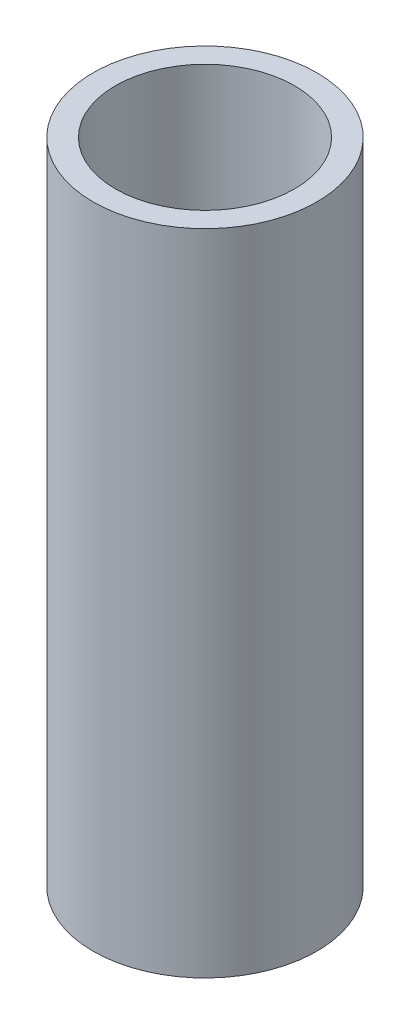
ISO-10303-21;
HEADER;
FILE_DESCRIPTION(('STEP AP214'),'2;1');
FILE_NAME('part.step','',(''),(''),'','','');
FILE_SCHEMA(('AUTOMOTIVE_DESIGN { 1 0 10303 214 1 1 1 1 }'));
ENDSEC;
DATA;
#1=APPLICATION_CONTEXT('core data for automotive mechanical design processes');
#2=APPLICATION_PROTOCOL_DEFINITION('international standard','automotive_design',2000,#1);
#3=PRODUCT_CONTEXT('',#1,'mechanical');
#4=PRODUCT('Part','Part','',(#3));
#5=PRODUCT_RELATED_PRODUCT_CATEGORY('part','',(#4));
#6=PRODUCT_DEFINITION_FORMATION('','',#4);
#7=PRODUCT_DEFINITION_CONTEXT('part definition',#1,'design');
#8=PRODUCT_DEFINITION('design','',#6,#7);
#9=PRODUCT_DEFINITION_SHAPE('','',#8);
#10=(LENGTH_UNIT() NAMED_UNIT(*) SI_UNIT(.MILLI.,.METRE.));
#11=(NAMED_UNIT(*) PLANE_ANGLE_UNIT() SI_UNIT($,.RADIAN.));
#12=(NAMED_UNIT(*) SI_UNIT($,.STERADIAN.) SOLID_ANGLE_UNIT());
#13=UNCERTAINTY_MEASURE_WITH_UNIT(LENGTH_MEASURE(1.E-05),#10,'distance_accuracy_value','');
#14=(GEOMETRIC_REPRESENTATION_CONTEXT(3) GLOBAL_UNCERTAINTY_ASSIGNED_CONTEXT((#13)) GLOBAL_UNIT_ASSIGNED_CONTEXT((#10,
#11,#12)) REPRESENTATION_CONTEXT('',''));
#15=CARTESIAN_POINT('',(0.,0.,0.));
#16=DIRECTION('',(0.,0.,1.));
#17=DIRECTION('',(1.,0.,0.));
#18=AXIS2_PLACEMENT_3D('',#15,#16,#17);
#19=CARTESIAN_POINT('',(0.,29.,0.));
#20=DIRECTION('',(0.,1.,0.));
#21=DIRECTION('',(0.,0.,1.));
#22=AXIS2_PLACEMENT_3D('',#19,#20,#21);
#23=PLANE('',#22);
#24=CARTESIAN_POINT('',(0.,29.,0.));
#25=DIRECTION('',(0.,1.,0.));
#26=DIRECTION('',(0.,0.,1.));
#27=AXIS2_PLACEMENT_3D('',#24,#25,#26);
#28=CIRCLE('',#27,5.);
#29=CARTESIAN_POINT('',(0.,29.,-5.));
#30=VERTEX_POINT('',#29);
#31=EDGE_CURVE('E10',#30,#30,#28,.T.);
#32=ORIENTED_EDGE('',*,*,#31,.T.);
#33=EDGE_LOOP('',(#32));
#34=FACE_BOUND('',#33,.T.);
#35=CARTESIAN_POINT('',(0.,29.,0.));
#36=DIRECTION('',(0.,1.,0.));
#37=DIRECTION('',(0.,0.,1.));
#38=AXIS2_PLACEMENT_3D('',#35,#36,#37);
#39=CIRCLE('',#38,4.);
#40=CARTESIAN_POINT('',(0.,29.,-4.));
#41=VERTEX_POINT('',#40);
#42=EDGE_CURVE('E44',#41,#41,#39,.T.);
#43=ORIENTED_EDGE('',*,*,#42,.F.);
#44=EDGE_LOOP('',(#43));
#45=FACE_BOUND('',#44,.T.);
#46=ADVANCED_FACE('F33',(#34,#45),#23,.T.);
#47=CARTESIAN_POINT('',(0.,0.,0.));
#48=DIRECTION('',(0.,1.,0.));
#49=DIRECTION('',(0.,0.,1.));
#50=AXIS2_PLACEMENT_3D('',#47,#48,#49);
#51=PLANE('',#50);
#52=CARTESIAN_POINT('',(0.,0.,0.));
#53=DIRECTION('',(0.,1.,0.));
#54=DIRECTION('',(0.,0.,1.));
#55=AXIS2_PLACEMENT_3D('',#52,#53,#54);
#56=CIRCLE('',#55,5.);
#57=CARTESIAN_POINT('',(0.,0.,-5.));
#58=VERTEX_POINT('',#57);
#59=EDGE_CURVE('E37',#58,#58,#56,.T.);
#60=ORIENTED_EDGE('',*,*,#59,.F.);
#61=EDGE_LOOP('',(#60));
#62=FACE_BOUND('',#61,.T.);
#63=CARTESIAN_POINT('',(0.,0.,0.));
#64=DIRECTION('',(0.,1.,0.));
#65=DIRECTION('',(0.,0.,1.));
#66=AXIS2_PLACEMENT_3D('',#63,#64,#65);
#67=CIRCLE('',#66,4.);
#68=CARTESIAN_POINT('',(0.,0.,-4.));
#69=VERTEX_POINT('',#68);
#70=EDGE_CURVE('E46',#69,#69,#67,.T.);
#71=ORIENTED_EDGE('',*,*,#70,.T.);
#72=EDGE_LOOP('',(#71));
#73=FACE_BOUND('',#72,.T.);
#74=ADVANCED_FACE('F56',(#62,#73),#51,.F.);
#75=CARTESIAN_POINT('',(0.,29.,0.));
#76=DIRECTION('',(0.,-1.,0.));
#77=DIRECTION('',(0.,0.,-1.));
#78=AXIS2_PLACEMENT_3D('',#75,#76,#77);
#79=CYLINDRICAL_SURFACE('',#78,5.);
#80=CARTESIAN_POINT('',(0.,29.,-5.));
#81=CARTESIAN_POINT('',(0.,28.6979166666667,-5.));
#82=CARTESIAN_POINT('',(0.,28.3958333333333,-5.));
#83=CARTESIAN_POINT('',(0.,27.7916666666667,-5.));
#84=CARTESIAN_POINT('',(0.,27.4895833333333,-5.));
#85=CARTESIAN_POINT('',(0.,26.8854166666667,-5.));
#86=CARTESIAN_POINT('',(0.,26.5833333333333,-5.));
#87=CARTESIAN_POINT('',(0.,25.9791666666667,-5.));
#88=CARTESIAN_POINT('',(0.,25.6770833333333,-5.));
#89=CARTESIAN_POINT('',(0.,25.0729166666667,-5.));
#90=CARTESIAN_POINT('',(0.,24.7708333333333,-5.));
#91=CARTESIAN_POINT('',(0.,24.1666666666667,-5.));
#92=CARTESIAN_POINT('',(0.,23.8645833333333,-5.));
#93=CARTESIAN_POINT('',(0.,23.2604166666667,-5.));
#94=CARTESIAN_POINT('',(0.,22.9583333333333,-5.));
#95=CARTESIAN_POINT('',(0.,22.3541666666667,-5.));
#96=CARTESIAN_POINT('',(0.,22.0520833333333,-5.));
#97=CARTESIAN_POINT('',(0.,21.4479166666667,-5.));
#98=CARTESIAN_POINT('',(0.,21.1458333333333,-5.));
#99=CARTESIAN_POINT('',(0.,20.5416666666667,-5.));
#100=CARTESIAN_POINT('',(0.,20.2395833333333,-5.));
#101=CARTESIAN_POINT('',(0.,19.6354166666667,-5.));
#102=CARTESIAN_POINT('',(0.,19.3333333333333,-5.));
#103=CARTESIAN_POINT('',(0.,18.7291666666667,-5.));
#104=CARTESIAN_POINT('',(0.,18.4270833333333,-5.));
#105=CARTESIAN_POINT('',(0.,17.8229166666667,-5.));
#106=CARTESIAN_POINT('',(0.,17.5208333333333,-5.));
#107=CARTESIAN_POINT('',(0.,16.9166666666667,-5.));
#108=CARTESIAN_POINT('',(0.,16.6145833333333,-5.));
#109=CARTESIAN_POINT('',(0.,16.0104166666667,-5.));
#110=CARTESIAN_POINT('',(0.,15.7083333333333,-5.));
#111=CARTESIAN_POINT('',(0.,15.1041666666667,-5.));
#112=CARTESIAN_POINT('',(0.,14.8020833333333,-5.));
#113=CARTESIAN_POINT('',(0.,14.1979166666667,-5.));
#114=CARTESIAN_POINT('',(0.,13.8958333333333,-5.));
#115=CARTESIAN_POINT('',(0.,13.2916666666667,-5.));
#116=CARTESIAN_POINT('',(0.,12.9895833333333,-5.));
#117=CARTESIAN_POINT('',(0.,12.3854166666667,-5.));
#118=CARTESIAN_POINT('',(0.,12.0833333333333,-5.));
#119=CARTESIAN_POINT('',(0.,11.4791666666667,-5.));
#120=CARTESIAN_POINT('',(0.,11.1770833333333,-5.));
#121=CARTESIAN_POINT('',(0.,10.5729166666667,-5.));
#122=CARTESIAN_POINT('',(0.,10.2708333333333,-5.));
#123=CARTESIAN_POINT('',(0.,9.66666666666667,-5.));
#124=CARTESIAN_POINT('',(0.,9.36458333333333,-5.));
#125=CARTESIAN_POINT('',(0.,8.76041666666667,-5.));
#126=CARTESIAN_POINT('',(0.,8.45833333333333,-5.));
#127=CARTESIAN_POINT('',(0.,7.85416666666667,-5.));
#128=CARTESIAN_POINT('',(0.,7.55208333333333,-5.));
#129=CARTESIAN_POINT('',(0.,6.94791666666667,-5.));
#130=CARTESIAN_POINT('',(0.,6.64583333333333,-5.));
#131=CARTESIAN_POINT('',(0.,6.04166666666667,-5.));
#132=CARTESIAN_POINT('',(0.,5.73958333333333,-5.));
#133=CARTESIAN_POINT('',(0.,5.13541666666667,-5.));
#134=CARTESIAN_POINT('',(0.,4.83333333333333,-5.));
#135=CARTESIAN_POINT('',(0.,4.22916666666667,-5.));
#136=CARTESIAN_POINT('',(0.,3.92708333333333,-5.));
#137=CARTESIAN_POINT('',(0.,3.32291666666667,-5.));
#138=CARTESIAN_POINT('',(0.,3.02083333333333,-5.));
#139=CARTESIAN_POINT('',(0.,2.41666666666667,-5.));
#140=CARTESIAN_POINT('',(0.,2.11458333333333,-5.));
#141=CARTESIAN_POINT('',(0.,1.51041666666667,-5.));
#142=CARTESIAN_POINT('',(0.,1.20833333333333,-5.));
#143=CARTESIAN_POINT('',(0.,0.604166666666667,-5.));
#144=CARTESIAN_POINT('',(0.,0.302083333333333,-5.));
#145=CARTESIAN_POINT('',(0.,0.,-5.));
#146=B_SPLINE_CURVE_WITH_KNOTS('',3,(#80,#81,#82,#83,#84,#85,#86,#87,#88,#89,#90,#91,#92,#93,
#94,#95,#96,#97,#98,#99,#100,#101,#102,#103,#104,#105,#106,#107,#108,#109,#110,#111,#112,#113,
#114,#115,#116,#117,#118,#119,#120,#121,#122,#123,#124,#125,#126,#127,#128,#129,#130,#131,#132,
#133,#134,#135,#136,#137,#138,#139,#140,#141,#142,#143,#144,#145),.UNSPECIFIED.,.F.,.F.,(4,2,2,
2,2,2,2,2,2,2,2,2,2,2,2,2,2,2,2,2,2,2,2,2,2,2,2,2,2,2,2,2,4),(0.,0.906249999999997,1.8125,
2.71875,3.625,4.53125,5.4375,6.34375,7.25,8.15625,9.0625,9.96875,10.875,11.78125,12.6875,
13.59375,14.5,15.40625,16.3125,17.21875,18.125,19.03125,19.9375,20.84375,21.75,22.65625,23.5625,
24.46875,25.375,26.28125,27.1875,28.09375,29.),.UNSPECIFIED.);
#147=EDGE_CURVE('BSEAM35',#30,#58,#146,.T.);
#148=ORIENTED_EDGE('',*,*,#31,.F.);
#149=ORIENTED_EDGE('',*,*,#59,.T.);
#150=ORIENTED_EDGE('',*,*,#147,.T.);
#151=ORIENTED_EDGE('',*,*,#147,.F.);
#152=EDGE_LOOP('',(#148,#150,#149,#151));
#153=FACE_BOUND('',#152,.T.);
#154=ADVANCED_FACE('F35',(#153),#79,.T.);
#155=CARTESIAN_POINT('',(0.,29.,0.));
#156=DIRECTION('',(0.,-1.,0.));
#157=DIRECTION('',(0.,0.,-1.));
#158=AXIS2_PLACEMENT_3D('',#155,#156,#157);
#159=CYLINDRICAL_SURFACE('',#158,4.);
#160=CARTESIAN_POINT('',(0.,29.,-4.));
#161=CARTESIAN_POINT('',(0.,28.6979166666667,-4.));
#162=CARTESIAN_POINT('',(0.,28.3958333333333,-4.));
#163=CARTESIAN_POINT('',(0.,27.7916666666667,-4.));
#164=CARTESIAN_POINT('',(0.,27.4895833333333,-4.));
#165=CARTESIAN_POINT('',(0.,26.8854166666667,-4.));
#166=CARTESIAN_POINT('',(0.,26.5833333333333,-4.));
#167=CARTESIAN_POINT('',(0.,25.9791666666667,-4.));
#168=CARTESIAN_POINT('',(0.,25.6770833333333,-4.));
#169=CARTESIAN_POINT('',(0.,25.0729166666667,-4.));
#170=CARTESIAN_POINT('',(0.,24.7708333333333,-4.));
#171=CARTESIAN_POINT('',(0.,24.1666666666667,-4.));
#172=CARTESIAN_POINT('',(0.,23.8645833333333,-4.));
#173=CARTESIAN_POINT('',(0.,23.2604166666667,-4.));
#174=CARTESIAN_POINT('',(0.,22.9583333333333,-4.));
#175=CARTESIAN_POINT('',(0.,22.3541666666667,-4.));
#176=CARTESIAN_POINT('',(0.,22.0520833333333,-4.));
#177=CARTESIAN_POINT('',(0.,21.4479166666667,-4.));
#178=CARTESIAN_POINT('',(0.,21.1458333333333,-4.));
#179=CARTESIAN_POINT('',(0.,20.5416666666667,-4.));
#180=CARTESIAN_POINT('',(0.,20.2395833333333,-4.));
#181=CARTESIAN_POINT('',(0.,19.6354166666667,-4.));
#182=CARTESIAN_POINT('',(0.,19.3333333333333,-4.));
#183=CARTESIAN_POINT('',(0.,18.7291666666667,-4.));
#184=CARTESIAN_POINT('',(0.,18.4270833333333,-4.));
#185=CARTESIAN_POINT('',(0.,17.8229166666667,-4.));
#186=CARTESIAN_POINT('',(0.,17.5208333333333,-4.));
#187=CARTESIAN_POINT('',(0.,16.9166666666667,-4.));
#188=CARTESIAN_POINT('',(0.,16.6145833333333,-4.));
#189=CARTESIAN_POINT('',(0.,16.0104166666667,-4.));
#190=CARTESIAN_POINT('',(0.,15.7083333333333,-4.));
#191=CARTESIAN_POINT('',(0.,15.1041666666667,-4.));
#192=CARTESIAN_POINT('',(0.,14.8020833333333,-4.));
#193=CARTESIAN_POINT('',(0.,14.1979166666667,-4.));
#194=CARTESIAN_POINT('',(0.,13.8958333333333,-4.));
#195=CARTESIAN_POINT('',(0.,13.2916666666667,-4.));
#196=CARTESIAN_POINT('',(0.,12.9895833333333,-4.));
#197=CARTESIAN_POINT('',(0.,12.3854166666667,-4.));
#198=CARTESIAN_POINT('',(0.,12.0833333333333,-4.));
#199=CARTESIAN_POINT('',(0.,11.4791666666667,-4.));
#200=CARTESIAN_POINT('',(0.,11.1770833333333,-4.));
#201=CARTESIAN_POINT('',(0.,10.5729166666667,-4.));
#202=CARTESIAN_POINT('',(0.,10.2708333333333,-4.));
#203=CARTESIAN_POINT('',(0.,9.66666666666667,-4.));
#204=CARTESIAN_POINT('',(0.,9.36458333333333,-4.));
#205=CARTESIAN_POINT('',(0.,8.76041666666667,-4.));
#206=CARTESIAN_POINT('',(0.,8.45833333333333,-4.));
#207=CARTESIAN_POINT('',(0.,7.85416666666667,-4.));
#208=CARTESIAN_POINT('',(0.,7.55208333333333,-4.));
#209=CARTESIAN_POINT('',(0.,6.94791666666667,-4.));
#210=CARTESIAN_POINT('',(0.,6.64583333333333,-4.));
#211=CARTESIAN_POINT('',(0.,6.04166666666667,-4.));
#212=CARTESIAN_POINT('',(0.,5.73958333333333,-4.));
#213=CARTESIAN_POINT('',(0.,5.13541666666667,-4.));
#214=CARTESIAN_POINT('',(0.,4.83333333333333,-4.));
#215=CARTESIAN_POINT('',(0.,4.22916666666667,-4.));
#216=CARTESIAN_POINT('',(0.,3.92708333333333,-4.));
#217=CARTESIAN_POINT('',(0.,3.32291666666667,-4.));
#218=CARTESIAN_POINT('',(0.,3.02083333333333,-4.));
#219=CARTESIAN_POINT('',(0.,2.41666666666667,-4.));
#220=CARTESIAN_POINT('',(0.,2.11458333333333,-4.));
#221=CARTESIAN_POINT('',(0.,1.51041666666667,-4.));
#222=CARTESIAN_POINT('',(0.,1.20833333333333,-4.));
#223=CARTESIAN_POINT('',(0.,0.604166666666667,-4.));
#224=CARTESIAN_POINT('',(0.,0.302083333333333,-4.));
#225=CARTESIAN_POINT('',(0.,0.,-4.));
#226=B_SPLINE_CURVE_WITH_KNOTS('',3,(#160,#161,#162,#163,#164,#165,#166,#167,#168,#169,#170,
#171,#172,#173,#174,#175,#176,#177,#178,#179,#180,#181,#182,#183,#184,#185,#186,#187,#188,#189,
#190,#191,#192,#193,#194,#195,#196,#197,#198,#199,#200,#201,#202,#203,#204,#205,#206,#207,#208,
#209,#210,#211,#212,#213,#214,#215,#216,#217,#218,#219,#220,#221,#222,#223,#224,#225),
.UNSPECIFIED.,.F.,.F.,(4,2,2,2,2,2,2,2,2,2,2,2,2,2,2,2,2,2,2,2,2,2,2,2,2,2,2,2,2,2,2,2,4),(0.,
0.906249999999997,1.8125,2.71875,3.625,4.53125,5.4375,6.34375,7.25,8.15625,9.0625,9.96875,
10.875,11.78125,12.6875,13.59375,14.5,15.40625,16.3125,17.21875,18.125,19.03125,19.9375,
20.84375,21.75,22.65625,23.5625,24.46875,25.375,26.28125,27.1875,28.09375,29.),.UNSPECIFIED.);
#227=EDGE_CURVE('BSEAM52',#41,#69,#226,.T.);
#228=ORIENTED_EDGE('',*,*,#42,.T.);
#229=ORIENTED_EDGE('',*,*,#70,.F.);
#230=ORIENTED_EDGE('',*,*,#227,.T.);
#231=ORIENTED_EDGE('',*,*,#227,.F.);
#232=EDGE_LOOP('',(#228,#230,#229,#231));
#233=FACE_BOUND('',#232,.T.);
#234=ADVANCED_FACE('F52',(#233),#159,.F.);
#235=CLOSED_SHELL('',(#46,#74,#154,#234));
#236=MANIFOLD_SOLID_BREP('B2',#235);
#237=ADVANCED_BREP_SHAPE_REPRESENTATION('',(#18,#236),#14);
#238=SHAPE_DEFINITION_REPRESENTATION(#9,#237);
ENDSEC;
END-ISO-10303-21;
